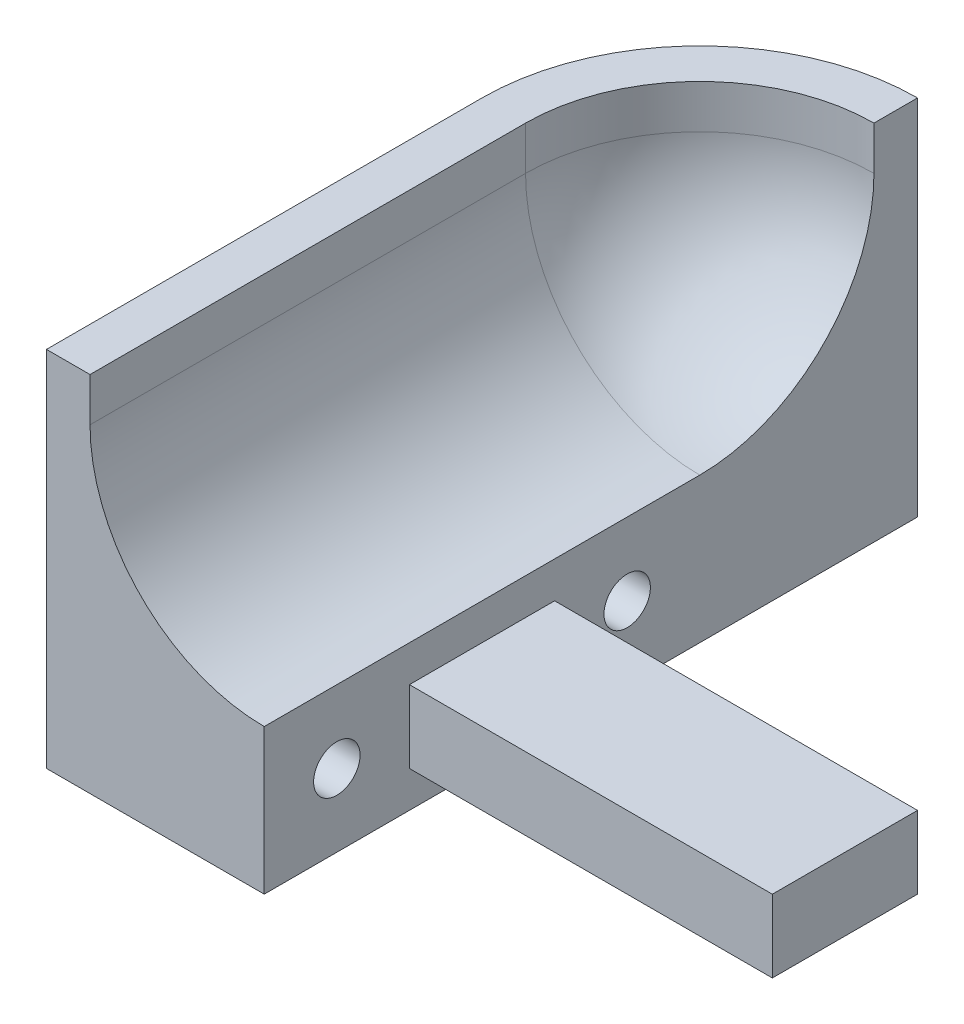
ISO-10303-21;
HEADER;
FILE_DESCRIPTION(('STEP AP214'),'2;1');
FILE_NAME('part.step','',(''),(''),'','','');
FILE_SCHEMA(('AUTOMOTIVE_DESIGN { 1 0 10303 214 1 1 1 1 }'));
ENDSEC;
DATA;
#1=APPLICATION_CONTEXT('core data for automotive mechanical design processes');
#2=APPLICATION_PROTOCOL_DEFINITION('international standard','automotive_design',2000,#1);
#3=PRODUCT_CONTEXT('',#1,'mechanical');
#4=PRODUCT('Part','Part','',(#3));
#5=PRODUCT_RELATED_PRODUCT_CATEGORY('part','',(#4));
#6=PRODUCT_DEFINITION_FORMATION('','',#4);
#7=PRODUCT_DEFINITION_CONTEXT('part definition',#1,'design');
#8=PRODUCT_DEFINITION('design','',#6,#7);
#9=PRODUCT_DEFINITION_SHAPE('','',#8);
#10=(LENGTH_UNIT() NAMED_UNIT(*) SI_UNIT(.MILLI.,.METRE.));
#11=(NAMED_UNIT(*) PLANE_ANGLE_UNIT() SI_UNIT($,.RADIAN.));
#12=(NAMED_UNIT(*) SI_UNIT($,.STERADIAN.) SOLID_ANGLE_UNIT());
#13=UNCERTAINTY_MEASURE_WITH_UNIT(LENGTH_MEASURE(1.E-05),#10,'distance_accuracy_value','');
#14=(GEOMETRIC_REPRESENTATION_CONTEXT(3) GLOBAL_UNCERTAINTY_ASSIGNED_CONTEXT((#13)) GLOBAL_UNIT_ASSIGNED_CONTEXT((#10,
#11,#12)) REPRESENTATION_CONTEXT('',''));
#15=CARTESIAN_POINT('',(0.,0.,0.));
#16=DIRECTION('',(0.,0.,1.));
#17=DIRECTION('',(1.,0.,0.));
#18=AXIS2_PLACEMENT_3D('',#15,#16,#17);
#19=CARTESIAN_POINT('',(0.,10.,0.));
#20=DIRECTION('',(1.,0.,0.));
#21=DIRECTION('',(0.,0.,-1.));
#22=AXIS2_PLACEMENT_3D('',#19,#20,#21);
#23=PLANE('',#22);
#24=DIRECTION('',(0.,0.,1.));
#25=VECTOR('',#24,1.);
#26=CARTESIAN_POINT('',(0.,0.,0.));
#27=LINE('',#26,#25);
#28=CARTESIAN_POINT('',(0.,0.,-30.));
#29=VERTEX_POINT('',#28);
#30=CARTESIAN_POINT('',(0.,0.,0.));
#31=VERTEX_POINT('',#30);
#32=EDGE_CURVE('E436',#29,#31,#27,.T.);
#33=ORIENTED_EDGE('',*,*,#32,.T.);
#34=DIRECTION('',(0.,-1.,0.));
#35=VECTOR('',#34,1.);
#36=CARTESIAN_POINT('',(0.,10.,0.));
#37=LINE('',#36,#35);
#38=CARTESIAN_POINT('',(0.,25.,0.));
#39=VERTEX_POINT('',#38);
#40=EDGE_CURVE('E451',#39,#31,#37,.T.);
#41=ORIENTED_EDGE('',*,*,#40,.F.);
#42=DIRECTION('',(0.,0.,1.));
#43=VECTOR('',#42,1.);
#44=CARTESIAN_POINT('',(0.,25.,-30.));
#45=LINE('',#44,#43);
#46=CARTESIAN_POINT('',(0.,25.,-30.));
#47=VERTEX_POINT('',#46);
#48=EDGE_CURVE('E413',#47,#39,#45,.T.);
#49=ORIENTED_EDGE('',*,*,#48,.F.);
#50=DIRECTION('',(0.,-1.,0.));
#51=VECTOR('',#50,1.);
#52=CARTESIAN_POINT('',(0.,10.,-30.));
#53=LINE('',#52,#51);
#54=EDGE_CURVE('E447',#47,#29,#53,.T.);
#55=ORIENTED_EDGE('',*,*,#54,.T.);
#56=EDGE_LOOP('',(#33,#41,#49,#55));
#57=FACE_BOUND('',#56,.T.);
#58=DIRECTION('',(0.,0.,1.));
#59=VECTOR('',#58,1.);
#60=CARTESIAN_POINT('',(0.,2.40192378864668,-3.5));
#61=LINE('',#60,#59);
#62=CARTESIAN_POINT('',(0.,2.40192378864668,-6.5));
#63=VERTEX_POINT('',#62);
#64=CARTESIAN_POINT('',(0.,2.40192378864668,-3.5));
#65=VERTEX_POINT('',#64);
#66=EDGE_CURVE('E297',#63,#65,#61,.T.);
#67=ORIENTED_EDGE('',*,*,#66,.F.);
#68=DIRECTION('',(0.,-0.866025403784439,0.5));
#69=VECTOR('',#68,1.);
#70=CARTESIAN_POINT('',(0.,2.40192378864668,-6.5));
#71=LINE('',#70,#69);
#72=CARTESIAN_POINT('',(0.,5.,-8.));
#73=VERTEX_POINT('',#72);
#74=EDGE_CURVE('E64',#73,#63,#71,.T.);
#75=ORIENTED_EDGE('',*,*,#74,.F.);
#76=DIRECTION('',(0.,-0.866025403784439,-0.5));
#77=VECTOR('',#76,1.);
#78=CARTESIAN_POINT('',(0.,5.,-8.));
#79=LINE('',#78,#77);
#80=CARTESIAN_POINT('',(0.,7.59807621135332,-6.5));
#81=VERTEX_POINT('',#80);
#82=EDGE_CURVE('E274',#81,#73,#79,.T.);
#83=ORIENTED_EDGE('',*,*,#82,.F.);
#84=DIRECTION('',(0.,0.,-1.));
#85=VECTOR('',#84,1.);
#86=CARTESIAN_POINT('',(0.,7.59807621135332,-6.5));
#87=LINE('',#86,#85);
#88=CARTESIAN_POINT('',(0.,7.59807621135331,-3.5));
#89=VERTEX_POINT('',#88);
#90=EDGE_CURVE('E309',#89,#81,#87,.T.);
#91=ORIENTED_EDGE('',*,*,#90,.F.);
#92=DIRECTION('',(0.,0.866025403784439,-0.5));
#93=VECTOR('',#92,1.);
#94=CARTESIAN_POINT('',(0.,7.59807621135331,-3.5));
#95=LINE('',#94,#93);
#96=CARTESIAN_POINT('',(0.,5.,-2.));
#97=VERTEX_POINT('',#96);
#98=EDGE_CURVE('E305',#97,#89,#95,.T.);
#99=ORIENTED_EDGE('',*,*,#98,.F.);
#100=DIRECTION('',(0.,0.866025403784439,0.5));
#101=VECTOR('',#100,1.);
#102=CARTESIAN_POINT('',(0.,5.,-2.));
#103=LINE('',#102,#101);
#104=EDGE_CURVE('E301',#65,#97,#103,.T.);
#105=ORIENTED_EDGE('',*,*,#104,.F.);
#106=EDGE_LOOP('',(#67,#75,#83,#91,#99,#105));
#107=FACE_BOUND('',#106,.T.);
#108=DIRECTION('',(0.,-0.866025403784439,-0.5));
#109=VECTOR('',#108,1.);
#110=CARTESIAN_POINT('',(0.,2.40192378864668,-23.5));
#111=LINE('',#110,#109);
#112=CARTESIAN_POINT('',(0.,5.,-22.));
#113=VERTEX_POINT('',#112);
#114=CARTESIAN_POINT('',(0.,2.40192378864668,-23.5));
#115=VERTEX_POINT('',#114);
#116=EDGE_CURVE('E56',#113,#115,#111,.T.);
#117=ORIENTED_EDGE('',*,*,#116,.T.);
#118=DIRECTION('',(0.,0.,-1.));
#119=VECTOR('',#118,1.);
#120=CARTESIAN_POINT('',(0.,2.40192378864668,-26.5));
#121=LINE('',#120,#119);
#122=CARTESIAN_POINT('',(0.,2.40192378864668,-26.5));
#123=VERTEX_POINT('',#122);
#124=EDGE_CURVE('E222',#115,#123,#121,.T.);
#125=ORIENTED_EDGE('',*,*,#124,.T.);
#126=DIRECTION('',(0.,0.866025403784439,-0.5));
#127=VECTOR('',#126,1.);
#128=CARTESIAN_POINT('',(0.,5.,-28.));
#129=LINE('',#128,#127);
#130=CARTESIAN_POINT('',(0.,5.,-28.));
#131=VERTEX_POINT('',#130);
#132=EDGE_CURVE('E226',#123,#131,#129,.T.);
#133=ORIENTED_EDGE('',*,*,#132,.T.);
#134=DIRECTION('',(0.,0.866025403784439,0.5));
#135=VECTOR('',#134,1.);
#136=CARTESIAN_POINT('',(0.,7.59807621135331,-26.5));
#137=LINE('',#136,#135);
#138=CARTESIAN_POINT('',(0.,7.59807621135331,-26.5));
#139=VERTEX_POINT('',#138);
#140=EDGE_CURVE('E248',#131,#139,#137,.T.);
#141=ORIENTED_EDGE('',*,*,#140,.T.);
#142=DIRECTION('',(0.,0.,1.));
#143=VECTOR('',#142,1.);
#144=CARTESIAN_POINT('',(0.,7.59807621135332,-23.5));
#145=LINE('',#144,#143);
#146=CARTESIAN_POINT('',(0.,7.59807621135332,-23.5));
#147=VERTEX_POINT('',#146);
#148=EDGE_CURVE('E244',#139,#147,#145,.T.);
#149=ORIENTED_EDGE('',*,*,#148,.T.);
#150=DIRECTION('',(0.,-0.866025403784439,0.5));
#151=VECTOR('',#150,1.);
#152=CARTESIAN_POINT('',(0.,5.,-22.));
#153=LINE('',#152,#151);
#154=EDGE_CURVE('E241',#147,#113,#153,.T.);
#155=ORIENTED_EDGE('',*,*,#154,.T.);
#156=EDGE_LOOP('',(#117,#125,#133,#141,#149,#155));
#157=FACE_BOUND('',#156,.T.);
#158=ADVANCED_FACE('F38',(#57,#107,#157),#23,.F.);
#159=CARTESIAN_POINT('',(15.,0.,-45.));
#160=DIRECTION('',(-1.,0.,0.));
#161=DIRECTION('',(0.,0.,1.));
#162=AXIS2_PLACEMENT_3D('',#159,#160,#161);
#163=PLANE('',#162);
#164=CARTESIAN_POINT('',(15.,22.,-30.));
#165=DIRECTION('',(-1.,0.,0.));
#166=DIRECTION('',(0.,0.,1.));
#167=AXIS2_PLACEMENT_3D('',#164,#165,#166);
#168=CIRCLE('',#167,12.);
#169=CARTESIAN_POINT('',(15.,10.,-30.));
#170=VERTEX_POINT('',#169);
#171=CARTESIAN_POINT('',(15.,22.,-42.));
#172=VERTEX_POINT('',#171);
#173=EDGE_CURVE('E390',#170,#172,#168,.F.);
#174=ORIENTED_EDGE('',*,*,#173,.F.);
#175=DIRECTION('',(0.,0.,1.));
#176=VECTOR('',#175,1.);
#177=CARTESIAN_POINT('',(15.,10.,-30.));
#178=LINE('',#177,#176);
#179=CARTESIAN_POINT('',(15.,10.,0.));
#180=VERTEX_POINT('',#179);
#181=EDGE_CURVE('E414',#180,#170,#178,.F.);
#182=ORIENTED_EDGE('',*,*,#181,.F.);
#183=DIRECTION('',(0.,1.,0.));
#184=VECTOR('',#183,1.);
#185=CARTESIAN_POINT('',(15.,0.,0.));
#186=LINE('',#185,#184);
#187=CARTESIAN_POINT('',(15.,0.,0.));
#188=VERTEX_POINT('',#187);
#189=EDGE_CURVE('E384',#188,#180,#186,.T.);
#190=ORIENTED_EDGE('',*,*,#189,.F.);
#191=DIRECTION('',(0.,0.,1.));
#192=VECTOR('',#191,1.);
#193=CARTESIAN_POINT('',(15.,0.,-45.));
#194=LINE('',#193,#192);
#195=CARTESIAN_POINT('',(15.,0.,-45.));
#196=VERTEX_POINT('',#195);
#197=EDGE_CURVE('E380',#196,#188,#194,.T.);
#198=ORIENTED_EDGE('',*,*,#197,.F.);
#199=DIRECTION('',(0.,1.,0.));
#200=VECTOR('',#199,1.);
#201=CARTESIAN_POINT('',(15.,0.,-45.));
#202=LINE('',#201,#200);
#203=CARTESIAN_POINT('',(15.,25.,-45.));
#204=VERTEX_POINT('',#203);
#205=EDGE_CURVE('E387',#196,#204,#202,.T.);
#206=ORIENTED_EDGE('',*,*,#205,.T.);
#207=DIRECTION('',(0.,0.,1.));
#208=VECTOR('',#207,1.);
#209=CARTESIAN_POINT('',(15.,25.,-45.));
#210=LINE('',#209,#208);
#211=CARTESIAN_POINT('',(15.,25.,-42.));
#212=VERTEX_POINT('',#211);
#213=EDGE_CURVE('E379',#204,#212,#210,.T.);
#214=ORIENTED_EDGE('',*,*,#213,.T.);
#215=DIRECTION('',(0.,-1.,0.));
#216=VECTOR('',#215,1.);
#217=CARTESIAN_POINT('',(15.,25.,-42.));
#218=LINE('',#217,#216);
#219=EDGE_CURVE('E397',#172,#212,#218,.F.);
#220=ORIENTED_EDGE('',*,*,#219,.F.);
#221=EDGE_LOOP('',(#174,#182,#190,#198,#206,#214,#220));
#222=FACE_BOUND('',#221,.T.);
#223=CARTESIAN_POINT('',(15.,5.,-5.));
#224=DIRECTION('',(-1.,0.,0.));
#225=DIRECTION('',(0.,0.,1.));
#226=AXIS2_PLACEMENT_3D('',#223,#224,#225);
#227=CIRCLE('',#226,1.6);
#228=CARTESIAN_POINT('',(15.,5.,-3.4));
#229=VERTEX_POINT('',#228);
#230=EDGE_CURVE('E401',#229,#229,#227,.T.);
#231=ORIENTED_EDGE('',*,*,#230,.T.);
#232=EDGE_LOOP('',(#231));
#233=FACE_BOUND('',#232,.T.);
#234=CARTESIAN_POINT('',(15.,5.,-25.));
#235=DIRECTION('',(-1.,0.,0.));
#236=DIRECTION('',(0.,0.,1.));
#237=AXIS2_PLACEMENT_3D('',#234,#235,#236);
#238=CIRCLE('',#237,1.6);
#239=CARTESIAN_POINT('',(15.,5.,-23.4));
#240=VERTEX_POINT('',#239);
#241=EDGE_CURVE('E405',#240,#240,#238,.T.);
#242=ORIENTED_EDGE('',*,*,#241,.T.);
#243=EDGE_LOOP('',(#242));
#244=FACE_BOUND('',#243,.T.);
#245=DIRECTION('',(0.,1.,0.));
#246=VECTOR('',#245,1.);
#247=CARTESIAN_POINT('',(15.,7.5,-20.));
#248=LINE('',#247,#246);
#249=CARTESIAN_POINT('',(15.,2.5,-20.));
#250=VERTEX_POINT('',#249);
#251=CARTESIAN_POINT('',(15.,7.5,-20.));
#252=VERTEX_POINT('',#251);
#253=EDGE_CURVE('E349',#250,#252,#248,.T.);
#254=ORIENTED_EDGE('',*,*,#253,.F.);
#255=DIRECTION('',(0.,0.,-1.));
#256=VECTOR('',#255,1.);
#257=CARTESIAN_POINT('',(15.,2.5,-20.));
#258=LINE('',#257,#256);
#259=CARTESIAN_POINT('',(15.,2.5,-10.));
#260=VERTEX_POINT('',#259);
#261=EDGE_CURVE('E339',#260,#250,#258,.T.);
#262=ORIENTED_EDGE('',*,*,#261,.F.);
#263=DIRECTION('',(0.,-1.,0.));
#264=VECTOR('',#263,1.);
#265=CARTESIAN_POINT('',(15.,7.5,-10.));
#266=LINE('',#265,#264);
#267=CARTESIAN_POINT('',(15.,7.5,-9.99999999999999));
#268=VERTEX_POINT('',#267);
#269=EDGE_CURVE('E357',#268,#260,#266,.T.);
#270=ORIENTED_EDGE('',*,*,#269,.F.);
#271=DIRECTION('',(0.,0.,1.));
#272=VECTOR('',#271,1.);
#273=CARTESIAN_POINT('',(15.,7.5,-20.));
#274=LINE('',#273,#272);
#275=EDGE_CURVE('E353',#252,#268,#274,.T.);
#276=ORIENTED_EDGE('',*,*,#275,.F.);
#277=EDGE_LOOP('',(#254,#262,#270,#276));
#278=FACE_BOUND('',#277,.T.);
#279=ADVANCED_FACE('F480',(#222,#233,#244,#278),#163,.F.);
#280=CARTESIAN_POINT('',(0.,10.,0.));
#281=DIRECTION('',(0.,0.,-1.));
#282=DIRECTION('',(-1.,0.,0.));
#283=AXIS2_PLACEMENT_3D('',#280,#281,#282);
#284=PLANE('',#283);
#285=DIRECTION('',(1.,0.,0.));
#286=VECTOR('',#285,1.);
#287=CARTESIAN_POINT('',(0.,0.,0.));
#288=LINE('',#287,#286);
#289=EDGE_CURVE('E440',#31,#188,#288,.T.);
#290=ORIENTED_EDGE('',*,*,#289,.T.);
#291=ORIENTED_EDGE('',*,*,#189,.T.);
#292=CARTESIAN_POINT('',(15.,22.,0.));
#293=DIRECTION('',(0.,0.,-1.));
#294=DIRECTION('',(-1.,0.,0.));
#295=AXIS2_PLACEMENT_3D('',#292,#293,#294);
#296=CIRCLE('',#295,12.);
#297=CARTESIAN_POINT('',(3.,22.,0.));
#298=VERTEX_POINT('',#297);
#299=EDGE_CURVE('E11',#180,#298,#296,.T.);
#300=ORIENTED_EDGE('',*,*,#299,.T.);
#301=DIRECTION('',(0.,-1.,0.));
#302=VECTOR('',#301,1.);
#303=CARTESIAN_POINT('',(3.,25.,0.));
#304=LINE('',#303,#302);
#305=CARTESIAN_POINT('',(3.,25.,0.));
#306=VERTEX_POINT('',#305);
#307=EDGE_CURVE('E432',#306,#298,#304,.T.);
#308=ORIENTED_EDGE('',*,*,#307,.F.);
#309=DIRECTION('',(1.,0.,0.));
#310=VECTOR('',#309,1.);
#311=CARTESIAN_POINT('',(0.,25.,0.));
#312=LINE('',#311,#310);
#313=EDGE_CURVE('E418',#39,#306,#312,.T.);
#314=ORIENTED_EDGE('',*,*,#313,.F.);
#315=ORIENTED_EDGE('',*,*,#40,.T.);
#316=EDGE_LOOP('',(#290,#291,#300,#308,#314,#315));
#317=FACE_BOUND('',#316,.T.);
#318=ADVANCED_FACE('F483',(#317),#284,.F.);
#319=CARTESIAN_POINT('',(15.,10.,-30.));
#320=DIRECTION('',(0.,-1.,0.));
#321=DIRECTION('',(0.,0.,-1.));
#322=AXIS2_PLACEMENT_3D('',#319,#320,#321);
#323=CYLINDRICAL_SURFACE('',#322,15.);
#324=CARTESIAN_POINT('',(15.,25.,-30.));
#325=DIRECTION('',(0.,1.,0.));
#326=DIRECTION('',(0.,0.,1.));
#327=AXIS2_PLACEMENT_3D('',#324,#325,#326);
#328=CIRCLE('',#327,15.);
#329=EDGE_CURVE('E410',#204,#47,#328,.T.);
#330=ORIENTED_EDGE('',*,*,#329,.F.);
#331=ORIENTED_EDGE('',*,*,#205,.F.);
#332=CARTESIAN_POINT('',(15.,0.,-30.));
#333=DIRECTION('',(0.,1.,0.));
#334=DIRECTION('',(0.,0.,-1.));
#335=AXIS2_PLACEMENT_3D('',#332,#333,#334);
#336=CIRCLE('',#335,15.);
#337=EDGE_CURVE('E444',#196,#29,#336,.T.);
#338=ORIENTED_EDGE('',*,*,#337,.T.);
#339=ORIENTED_EDGE('',*,*,#54,.F.);
#340=EDGE_LOOP('',(#330,#331,#338,#339));
#341=FACE_BOUND('',#340,.T.);
#342=ADVANCED_FACE('F551',(#341),#323,.T.);
#343=CARTESIAN_POINT('',(15.,0.,-30.));
#344=DIRECTION('',(0.,-1.,0.));
#345=DIRECTION('',(0.,0.,-1.));
#346=AXIS2_PLACEMENT_3D('',#343,#344,#345);
#347=PLANE('',#346);
#348=ORIENTED_EDGE('',*,*,#197,.T.);
#349=ORIENTED_EDGE('',*,*,#289,.F.);
#350=ORIENTED_EDGE('',*,*,#32,.F.);
#351=ORIENTED_EDGE('',*,*,#337,.F.);
#352=EDGE_LOOP('',(#348,#349,#350,#351));
#353=FACE_BOUND('',#352,.T.);
#354=ADVANCED_FACE('F547',(#353),#347,.T.);
#355=CARTESIAN_POINT('',(3.,25.,-30.));
#356=DIRECTION('',(-1.,0.,0.));
#357=DIRECTION('',(0.,0.,1.));
#358=AXIS2_PLACEMENT_3D('',#355,#356,#357);
#359=PLANE('',#358);
#360=ORIENTED_EDGE('',*,*,#307,.T.);
#361=DIRECTION('',(0.,0.,-1.));
#362=VECTOR('',#361,1.);
#363=CARTESIAN_POINT('',(3.,22.,-30.));
#364=LINE('',#363,#362);
#365=CARTESIAN_POINT('',(3.,22.,-30.));
#366=VERTEX_POINT('',#365);
#367=EDGE_CURVE('E455',#298,#366,#364,.T.);
#368=ORIENTED_EDGE('',*,*,#367,.T.);
#369=DIRECTION('',(0.,-1.,0.));
#370=VECTOR('',#369,1.);
#371=CARTESIAN_POINT('',(3.,25.,-30.));
#372=LINE('',#371,#370);
#373=CARTESIAN_POINT('',(3.,25.,-30.));
#374=VERTEX_POINT('',#373);
#375=EDGE_CURVE('E428',#374,#366,#372,.T.);
#376=ORIENTED_EDGE('',*,*,#375,.F.);
#377=DIRECTION('',(0.,0.,-1.));
#378=VECTOR('',#377,1.);
#379=CARTESIAN_POINT('',(3.,25.,-3.));
#380=LINE('',#379,#378);
#381=EDGE_CURVE('E421',#306,#374,#380,.T.);
#382=ORIENTED_EDGE('',*,*,#381,.F.);
#383=EDGE_LOOP('',(#360,#368,#376,#382));
#384=FACE_BOUND('',#383,.T.);
#385=ADVANCED_FACE('F536',(#384),#359,.F.);
#386=CARTESIAN_POINT('',(15.,25.,-30.));
#387=DIRECTION('',(0.,-1.,0.));
#388=DIRECTION('',(0.,0.,-1.));
#389=AXIS2_PLACEMENT_3D('',#386,#387,#388);
#390=CYLINDRICAL_SURFACE('',#389,12.);
#391=CARTESIAN_POINT('',(15.,22.,-30.));
#392=DIRECTION('',(0.,-1.,0.));
#393=DIRECTION('',(0.,0.,-1.));
#394=AXIS2_PLACEMENT_3D('',#391,#392,#393);
#395=CIRCLE('',#394,12.);
#396=EDGE_CURVE('E48',#366,#172,#395,.T.);
#397=ORIENTED_EDGE('',*,*,#396,.T.);
#398=ORIENTED_EDGE('',*,*,#219,.T.);
#399=CARTESIAN_POINT('',(15.,25.,-30.));
#400=DIRECTION('',(0.,-1.,0.));
#401=DIRECTION('',(0.,0.,1.));
#402=AXIS2_PLACEMENT_3D('',#399,#400,#401);
#403=CIRCLE('',#402,12.);
#404=EDGE_CURVE('E424',#374,#212,#403,.T.);
#405=ORIENTED_EDGE('',*,*,#404,.F.);
#406=ORIENTED_EDGE('',*,*,#375,.T.);
#407=EDGE_LOOP('',(#397,#398,#405,#406));
#408=FACE_BOUND('',#407,.T.);
#409=ADVANCED_FACE('F553',(#408),#390,.F.);
#410=CARTESIAN_POINT('',(15.,25.,-30.));
#411=DIRECTION('',(0.,1.,0.));
#412=DIRECTION('',(0.,0.,1.));
#413=AXIS2_PLACEMENT_3D('',#410,#411,#412);
#414=PLANE('',#413);
#415=ORIENTED_EDGE('',*,*,#213,.F.);
#416=ORIENTED_EDGE('',*,*,#329,.T.);
#417=ORIENTED_EDGE('',*,*,#48,.T.);
#418=ORIENTED_EDGE('',*,*,#313,.T.);
#419=ORIENTED_EDGE('',*,*,#381,.T.);
#420=ORIENTED_EDGE('',*,*,#404,.T.);
#421=EDGE_LOOP('',(#415,#416,#417,#418,#419,#420));
#422=FACE_BOUND('',#421,.T.);
#423=ADVANCED_FACE('F541',(#422),#414,.T.);
#424=CARTESIAN_POINT('',(30.,5.,-25.));
#425=DIRECTION('',(-1.,0.,0.));
#426=DIRECTION('',(0.,0.,1.));
#427=AXIS2_PLACEMENT_3D('',#424,#425,#426);
#428=CYLINDRICAL_SURFACE('',#427,1.6);
#429=CARTESIAN_POINT('',(4.,5.,-25.));
#430=DIRECTION('',(1.,0.,0.));
#431=DIRECTION('',(0.,0.,-1.));
#432=AXIS2_PLACEMENT_3D('',#429,#430,#431);
#433=CIRCLE('',#432,1.6);
#434=CARTESIAN_POINT('',(4.,5.,-26.6));
#435=VERTEX_POINT('',#434);
#436=EDGE_CURVE('E42',#435,#435,#433,.T.);
#437=ORIENTED_EDGE('',*,*,#436,.F.);
#438=EDGE_LOOP('',(#437));
#439=FACE_BOUND('',#438,.T.);
#440=ORIENTED_EDGE('',*,*,#241,.F.);
#441=EDGE_LOOP('',(#440));
#442=FACE_BOUND('',#441,.T.);
#443=ADVANCED_FACE('F476',(#439,#442),#428,.F.);
#444=CARTESIAN_POINT('',(30.,5.,-5.));
#445=DIRECTION('',(-1.,0.,0.));
#446=DIRECTION('',(0.,0.,1.));
#447=AXIS2_PLACEMENT_3D('',#444,#445,#446);
#448=CYLINDRICAL_SURFACE('',#447,1.6);
#449=CARTESIAN_POINT('',(4.,5.,-5.));
#450=DIRECTION('',(1.,0.,0.));
#451=DIRECTION('',(0.,0.,-1.));
#452=AXIS2_PLACEMENT_3D('',#449,#450,#451);
#453=CIRCLE('',#452,1.6);
#454=CARTESIAN_POINT('',(4.,5.,-6.6));
#455=VERTEX_POINT('',#454);
#456=EDGE_CURVE('E319',#455,#455,#453,.T.);
#457=ORIENTED_EDGE('',*,*,#456,.F.);
#458=EDGE_LOOP('',(#457));
#459=FACE_BOUND('',#458,.T.);
#460=ORIENTED_EDGE('',*,*,#230,.F.);
#461=EDGE_LOOP('',(#460));
#462=FACE_BOUND('',#461,.T.);
#463=ADVANCED_FACE('F473',(#459,#462),#448,.F.);
#464=CARTESIAN_POINT('',(15.,22.,-30.));
#465=DIRECTION('',(0.,-1.,0.));
#466=DIRECTION('',(0.,0.,-1.));
#467=AXIS2_PLACEMENT_3D('',#464,#465,#466);
#468=SPHERICAL_SURFACE('',#467,12.);
#469=CARTESIAN_POINT('',(15.,22.,-30.));
#470=DIRECTION('',(0.,0.,-1.));
#471=DIRECTION('',(-1.,0.,0.));
#472=AXIS2_PLACEMENT_3D('',#469,#470,#471);
#473=CIRCLE('',#472,12.);
#474=EDGE_CURVE('E409',#170,#366,#473,.T.);
#475=ORIENTED_EDGE('',*,*,#474,.F.);
#476=ORIENTED_EDGE('',*,*,#173,.T.);
#477=ORIENTED_EDGE('',*,*,#396,.F.);
#478=EDGE_LOOP('',(#475,#476,#477));
#479=FACE_BOUND('',#478,.T.);
#480=ADVANCED_FACE('F40',(#479),#468,.F.);
#481=CARTESIAN_POINT('',(15.,22.,-30.));
#482=DIRECTION('',(0.,0.,1.));
#483=DIRECTION('',(1.,0.,0.));
#484=AXIS2_PLACEMENT_3D('',#481,#482,#483);
#485=CYLINDRICAL_SURFACE('',#484,12.);
#486=ORIENTED_EDGE('',*,*,#299,.F.);
#487=ORIENTED_EDGE('',*,*,#181,.T.);
#488=ORIENTED_EDGE('',*,*,#474,.T.);
#489=ORIENTED_EDGE('',*,*,#367,.F.);
#490=EDGE_LOOP('',(#486,#487,#488,#489));
#491=FACE_BOUND('',#490,.T.);
#492=ADVANCED_FACE('F512',(#491),#485,.F.);
#493=CARTESIAN_POINT('',(40.,7.5,-20.));
#494=DIRECTION('',(0.,0.,1.));
#495=DIRECTION('',(1.,0.,0.));
#496=AXIS2_PLACEMENT_3D('',#493,#494,#495);
#497=PLANE('',#496);
#498=ORIENTED_EDGE('',*,*,#253,.T.);
#499=DIRECTION('',(-1.,0.,0.));
#500=VECTOR('',#499,1.);
#501=CARTESIAN_POINT('',(40.,7.5,-20.));
#502=LINE('',#501,#500);
#503=CARTESIAN_POINT('',(40.,7.5,-20.));
#504=VERTEX_POINT('',#503);
#505=EDGE_CURVE('E375',#504,#252,#502,.T.);
#506=ORIENTED_EDGE('',*,*,#505,.F.);
#507=DIRECTION('',(0.,1.,0.));
#508=VECTOR('',#507,1.);
#509=CARTESIAN_POINT('',(40.,7.5,-20.));
#510=LINE('',#509,#508);
#511=CARTESIAN_POINT('',(40.,2.5,-20.));
#512=VERTEX_POINT('',#511);
#513=EDGE_CURVE('E334',#512,#504,#510,.T.);
#514=ORIENTED_EDGE('',*,*,#513,.F.);
#515=DIRECTION('',(-1.,0.,0.));
#516=VECTOR('',#515,1.);
#517=CARTESIAN_POINT('',(40.,2.5,-20.));
#518=LINE('',#517,#516);
#519=EDGE_CURVE('E348',#512,#250,#518,.T.);
#520=ORIENTED_EDGE('',*,*,#519,.T.);
#521=EDGE_LOOP('',(#498,#506,#514,#520));
#522=FACE_BOUND('',#521,.T.);
#523=ADVANCED_FACE('F496',(#522),#497,.F.);
#524=CARTESIAN_POINT('',(40.,7.5,-20.));
#525=DIRECTION('',(0.,-1.,0.));
#526=DIRECTION('',(0.,0.,-1.));
#527=AXIS2_PLACEMENT_3D('',#524,#525,#526);
#528=PLANE('',#527);
#529=ORIENTED_EDGE('',*,*,#275,.T.);
#530=DIRECTION('',(-1.,0.,0.));
#531=VECTOR('',#530,1.);
#532=CARTESIAN_POINT('',(40.,7.5,-10.));
#533=LINE('',#532,#531);
#534=CARTESIAN_POINT('',(40.,7.5,-10.));
#535=VERTEX_POINT('',#534);
#536=EDGE_CURVE('E371',#535,#268,#533,.T.);
#537=ORIENTED_EDGE('',*,*,#536,.F.);
#538=DIRECTION('',(0.,0.,1.));
#539=VECTOR('',#538,1.);
#540=CARTESIAN_POINT('',(40.,7.5,-20.));
#541=LINE('',#540,#539);
#542=EDGE_CURVE('E338',#504,#535,#541,.T.);
#543=ORIENTED_EDGE('',*,*,#542,.F.);
#544=ORIENTED_EDGE('',*,*,#505,.T.);
#545=EDGE_LOOP('',(#529,#537,#543,#544));
#546=FACE_BOUND('',#545,.T.);
#547=ADVANCED_FACE('F504',(#546),#528,.F.);
#548=CARTESIAN_POINT('',(40.,7.5,-10.));
#549=DIRECTION('',(0.,0.,-1.));
#550=DIRECTION('',(0.,1.,0.));
#551=AXIS2_PLACEMENT_3D('',#548,#549,#550);
#552=PLANE('',#551);
#553=ORIENTED_EDGE('',*,*,#269,.T.);
#554=DIRECTION('',(-1.,0.,0.));
#555=VECTOR('',#554,1.);
#556=CARTESIAN_POINT('',(40.,2.5,-10.));
#557=LINE('',#556,#555);
#558=CARTESIAN_POINT('',(40.,2.5,-10.));
#559=VERTEX_POINT('',#558);
#560=EDGE_CURVE('E367',#559,#260,#557,.T.);
#561=ORIENTED_EDGE('',*,*,#560,.F.);
#562=DIRECTION('',(0.,-1.,0.));
#563=VECTOR('',#562,1.);
#564=CARTESIAN_POINT('',(40.,7.5,-10.));
#565=LINE('',#564,#563);
#566=EDGE_CURVE('E342',#535,#559,#565,.T.);
#567=ORIENTED_EDGE('',*,*,#566,.F.);
#568=ORIENTED_EDGE('',*,*,#536,.T.);
#569=EDGE_LOOP('',(#553,#561,#567,#568));
#570=FACE_BOUND('',#569,.T.);
#571=ADVANCED_FACE('F502',(#570),#552,.F.);
#572=CARTESIAN_POINT('',(40.,2.5,-20.));
#573=DIRECTION('',(0.,1.,0.));
#574=DIRECTION('',(0.,0.,1.));
#575=AXIS2_PLACEMENT_3D('',#572,#573,#574);
#576=PLANE('',#575);
#577=ORIENTED_EDGE('',*,*,#261,.T.);
#578=ORIENTED_EDGE('',*,*,#519,.F.);
#579=DIRECTION('',(0.,0.,-1.));
#580=VECTOR('',#579,1.);
#581=CARTESIAN_POINT('',(40.,2.5,-20.));
#582=LINE('',#581,#580);
#583=EDGE_CURVE('E345',#559,#512,#582,.T.);
#584=ORIENTED_EDGE('',*,*,#583,.F.);
#585=ORIENTED_EDGE('',*,*,#560,.T.);
#586=EDGE_LOOP('',(#577,#578,#584,#585));
#587=FACE_BOUND('',#586,.T.);
#588=ADVANCED_FACE('F492',(#587),#576,.F.);
#589=CARTESIAN_POINT('',(40.,0.,0.));
#590=DIRECTION('',(-1.,0.,0.));
#591=DIRECTION('',(0.,0.,1.));
#592=AXIS2_PLACEMENT_3D('',#589,#590,#591);
#593=PLANE('',#592);
#594=ORIENTED_EDGE('',*,*,#513,.T.);
#595=ORIENTED_EDGE('',*,*,#542,.T.);
#596=ORIENTED_EDGE('',*,*,#566,.T.);
#597=ORIENTED_EDGE('',*,*,#583,.T.);
#598=EDGE_LOOP('',(#594,#595,#596,#597));
#599=FACE_BOUND('',#598,.T.);
#600=ADVANCED_FACE('F498',(#599),#593,.F.);
#601=CARTESIAN_POINT('',(4.,2.40192378864668,-6.5));
#602=DIRECTION('',(0.,-0.5,-0.866025403784439));
#603=DIRECTION('',(0.,0.866025403784439,-0.5));
#604=AXIS2_PLACEMENT_3D('',#601,#602,#603);
#605=PLANE('',#604);
#606=ORIENTED_EDGE('',*,*,#74,.T.);
#607=DIRECTION('',(-1.,0.,0.));
#608=VECTOR('',#607,1.);
#609=CARTESIAN_POINT('',(4.,2.40192378864668,-6.5));
#610=LINE('',#609,#608);
#611=CARTESIAN_POINT('',(4.,2.40192378864668,-6.5));
#612=VERTEX_POINT('',#611);
#613=EDGE_CURVE('E294',#612,#63,#610,.T.);
#614=ORIENTED_EDGE('',*,*,#613,.F.);
#615=DIRECTION('',(0.,-0.866025403784439,0.5));
#616=VECTOR('',#615,1.);
#617=CARTESIAN_POINT('',(4.,2.40192378864668,-6.5));
#618=LINE('',#617,#616);
#619=CARTESIAN_POINT('',(4.,5.,-8.));
#620=VERTEX_POINT('',#619);
#621=EDGE_CURVE('E269',#620,#612,#618,.T.);
#622=ORIENTED_EDGE('',*,*,#621,.F.);
#623=DIRECTION('',(-1.,0.,0.));
#624=VECTOR('',#623,1.);
#625=CARTESIAN_POINT('',(4.,5.,-8.));
#626=LINE('',#625,#624);
#627=EDGE_CURVE('E316',#620,#73,#626,.T.);
#628=ORIENTED_EDGE('',*,*,#627,.T.);
#629=EDGE_LOOP('',(#606,#614,#622,#628));
#630=FACE_BOUND('',#629,.T.);
#631=ADVANCED_FACE('F613',(#630),#605,.F.);
#632=CARTESIAN_POINT('',(4.,5.,-8.));
#633=DIRECTION('',(0.,0.5,-0.866025403784439));
#634=DIRECTION('',(0.,0.866025403784439,0.5));
#635=AXIS2_PLACEMENT_3D('',#632,#633,#634);
#636=PLANE('',#635);
#637=ORIENTED_EDGE('',*,*,#82,.T.);
#638=ORIENTED_EDGE('',*,*,#627,.F.);
#639=DIRECTION('',(0.,-0.866025403784439,-0.5));
#640=VECTOR('',#639,1.);
#641=CARTESIAN_POINT('',(4.,5.,-8.));
#642=LINE('',#641,#640);
#643=CARTESIAN_POINT('',(4.,7.59807621135332,-6.5));
#644=VERTEX_POINT('',#643);
#645=EDGE_CURVE('E290',#644,#620,#642,.T.);
#646=ORIENTED_EDGE('',*,*,#645,.F.);
#647=DIRECTION('',(-1.,0.,0.));
#648=VECTOR('',#647,1.);
#649=CARTESIAN_POINT('',(4.,7.59807621135332,-6.5));
#650=LINE('',#649,#648);
#651=EDGE_CURVE('E320',#644,#81,#650,.T.);
#652=ORIENTED_EDGE('',*,*,#651,.T.);
#653=EDGE_LOOP('',(#637,#638,#646,#652));
#654=FACE_BOUND('',#653,.T.);
#655=ADVANCED_FACE('F631',(#654),#636,.F.);
#656=CARTESIAN_POINT('',(4.,7.59807621135332,-6.5));
#657=DIRECTION('',(0.,1.,0.));
#658=DIRECTION('',(0.,0.,1.));
#659=AXIS2_PLACEMENT_3D('',#656,#657,#658);
#660=PLANE('',#659);
#661=ORIENTED_EDGE('',*,*,#90,.T.);
#662=ORIENTED_EDGE('',*,*,#651,.F.);
#663=DIRECTION('',(0.,0.,-1.));
#664=VECTOR('',#663,1.);
#665=CARTESIAN_POINT('',(4.,7.59807621135332,-6.5));
#666=LINE('',#665,#664);
#667=CARTESIAN_POINT('',(4.,7.59807621135331,-3.5));
#668=VERTEX_POINT('',#667);
#669=EDGE_CURVE('E286',#668,#644,#666,.T.);
#670=ORIENTED_EDGE('',*,*,#669,.F.);
#671=DIRECTION('',(-1.,0.,0.));
#672=VECTOR('',#671,1.);
#673=CARTESIAN_POINT('',(4.,7.59807621135331,-3.5));
#674=LINE('',#673,#672);
#675=EDGE_CURVE('E323',#668,#89,#674,.T.);
#676=ORIENTED_EDGE('',*,*,#675,.T.);
#677=EDGE_LOOP('',(#661,#662,#670,#676));
#678=FACE_BOUND('',#677,.T.);
#679=ADVANCED_FACE('F640',(#678),#660,.F.);
#680=CARTESIAN_POINT('',(4.,7.59807621135331,-3.5));
#681=DIRECTION('',(0.,0.5,0.866025403784439));
#682=DIRECTION('',(0.,-0.866025403784439,0.5));
#683=AXIS2_PLACEMENT_3D('',#680,#681,#682);
#684=PLANE('',#683);
#685=ORIENTED_EDGE('',*,*,#98,.T.);
#686=ORIENTED_EDGE('',*,*,#675,.F.);
#687=DIRECTION('',(0.,0.866025403784439,-0.5));
#688=VECTOR('',#687,1.);
#689=CARTESIAN_POINT('',(4.,7.59807621135331,-3.5));
#690=LINE('',#689,#688);
#691=CARTESIAN_POINT('',(4.,5.,-2.));
#692=VERTEX_POINT('',#691);
#693=EDGE_CURVE('E282',#692,#668,#690,.T.);
#694=ORIENTED_EDGE('',*,*,#693,.F.);
#695=DIRECTION('',(-1.,0.,0.));
#696=VECTOR('',#695,1.);
#697=CARTESIAN_POINT('',(4.,5.,-2.));
#698=LINE('',#697,#696);
#699=EDGE_CURVE('E326',#692,#97,#698,.T.);
#700=ORIENTED_EDGE('',*,*,#699,.T.);
#701=EDGE_LOOP('',(#685,#686,#694,#700));
#702=FACE_BOUND('',#701,.T.);
#703=ADVANCED_FACE('F650',(#702),#684,.F.);
#704=CARTESIAN_POINT('',(4.,5.,-2.));
#705=DIRECTION('',(0.,-0.5,0.866025403784439));
#706=DIRECTION('',(0.,-0.866025403784439,-0.5));
#707=AXIS2_PLACEMENT_3D('',#704,#705,#706);
#708=PLANE('',#707);
#709=ORIENTED_EDGE('',*,*,#104,.T.);
#710=ORIENTED_EDGE('',*,*,#699,.F.);
#711=DIRECTION('',(0.,0.866025403784439,0.5));
#712=VECTOR('',#711,1.);
#713=CARTESIAN_POINT('',(4.,5.,-2.));
#714=LINE('',#713,#712);
#715=CARTESIAN_POINT('',(4.,2.40192378864668,-3.5));
#716=VERTEX_POINT('',#715);
#717=EDGE_CURVE('E278',#716,#692,#714,.T.);
#718=ORIENTED_EDGE('',*,*,#717,.F.);
#719=DIRECTION('',(-1.,0.,0.));
#720=VECTOR('',#719,1.);
#721=CARTESIAN_POINT('',(4.,2.40192378864668,-3.5));
#722=LINE('',#721,#720);
#723=EDGE_CURVE('E329',#716,#65,#722,.T.);
#724=ORIENTED_EDGE('',*,*,#723,.T.);
#725=EDGE_LOOP('',(#709,#710,#718,#724));
#726=FACE_BOUND('',#725,.T.);
#727=ADVANCED_FACE('F660',(#726),#708,.F.);
#728=CARTESIAN_POINT('',(4.,2.40192378864668,-3.5));
#729=DIRECTION('',(0.,-1.,0.));
#730=DIRECTION('',(0.,0.,-1.));
#731=AXIS2_PLACEMENT_3D('',#728,#729,#730);
#732=PLANE('',#731);
#733=ORIENTED_EDGE('',*,*,#66,.T.);
#734=ORIENTED_EDGE('',*,*,#723,.F.);
#735=DIRECTION('',(0.,0.,1.));
#736=VECTOR('',#735,1.);
#737=CARTESIAN_POINT('',(4.,2.40192378864668,-3.5));
#738=LINE('',#737,#736);
#739=EDGE_CURVE('E273',#612,#716,#738,.T.);
#740=ORIENTED_EDGE('',*,*,#739,.F.);
#741=ORIENTED_EDGE('',*,*,#613,.T.);
#742=EDGE_LOOP('',(#733,#734,#740,#741));
#743=FACE_BOUND('',#742,.T.);
#744=ADVANCED_FACE('F670',(#743),#732,.F.);
#745=CARTESIAN_POINT('',(4.,0.,0.));
#746=DIRECTION('',(1.,0.,0.));
#747=DIRECTION('',(0.,0.,-1.));
#748=AXIS2_PLACEMENT_3D('',#745,#746,#747);
#749=PLANE('',#748);
#750=ORIENTED_EDGE('',*,*,#456,.T.);
#751=EDGE_LOOP('',(#750));
#752=FACE_BOUND('',#751,.T.);
#753=ORIENTED_EDGE('',*,*,#621,.T.);
#754=ORIENTED_EDGE('',*,*,#739,.T.);
#755=ORIENTED_EDGE('',*,*,#717,.T.);
#756=ORIENTED_EDGE('',*,*,#693,.T.);
#757=ORIENTED_EDGE('',*,*,#669,.T.);
#758=ORIENTED_EDGE('',*,*,#645,.T.);
#759=EDGE_LOOP('',(#753,#754,#755,#756,#757,#758));
#760=FACE_BOUND('',#759,.T.);
#761=ADVANCED_FACE('F470',(#752,#760),#749,.F.);
#762=CARTESIAN_POINT('',(4.,2.40192378864668,-23.5));
#763=DIRECTION('',(0.,0.5,-0.866025403784439));
#764=DIRECTION('',(0.,0.866025403784439,0.5));
#765=AXIS2_PLACEMENT_3D('',#762,#763,#764);
#766=PLANE('',#765);
#767=ORIENTED_EDGE('',*,*,#116,.F.);
#768=DIRECTION('',(-1.,0.,0.));
#769=VECTOR('',#768,1.);
#770=CARTESIAN_POINT('',(4.,5.,-22.));
#771=LINE('',#770,#769);
#772=CARTESIAN_POINT('',(4.,5.,-22.));
#773=VERTEX_POINT('',#772);
#774=EDGE_CURVE('E203',#773,#113,#771,.T.);
#775=ORIENTED_EDGE('',*,*,#774,.F.);
#776=DIRECTION('',(0.,-0.866025403784439,-0.5));
#777=VECTOR('',#776,1.);
#778=CARTESIAN_POINT('',(4.,2.40192378864668,-23.5));
#779=LINE('',#778,#777);
#780=CARTESIAN_POINT('',(4.,2.40192378864668,-23.5));
#781=VERTEX_POINT('',#780);
#782=EDGE_CURVE('E211',#773,#781,#779,.T.);
#783=ORIENTED_EDGE('',*,*,#782,.T.);
#784=DIRECTION('',(-1.,0.,0.));
#785=VECTOR('',#784,1.);
#786=CARTESIAN_POINT('',(4.,2.40192378864668,-23.5));
#787=LINE('',#786,#785);
#788=EDGE_CURVE('E255',#781,#115,#787,.T.);
#789=ORIENTED_EDGE('',*,*,#788,.T.);
#790=EDGE_LOOP('',(#767,#775,#783,#789));
#791=FACE_BOUND('',#790,.T.);
#792=ADVANCED_FACE('F214',(#791),#766,.T.);
#793=CARTESIAN_POINT('',(4.,2.40192378864668,-26.5));
#794=DIRECTION('',(0.,1.,0.));
#795=DIRECTION('',(0.,0.,1.));
#796=AXIS2_PLACEMENT_3D('',#793,#794,#795);
#797=PLANE('',#796);
#798=ORIENTED_EDGE('',*,*,#124,.F.);
#799=ORIENTED_EDGE('',*,*,#788,.F.);
#800=DIRECTION('',(0.,0.,-1.));
#801=VECTOR('',#800,1.);
#802=CARTESIAN_POINT('',(4.,2.40192378864668,-26.5));
#803=LINE('',#802,#801);
#804=CARTESIAN_POINT('',(4.,2.40192378864668,-26.5));
#805=VERTEX_POINT('',#804);
#806=EDGE_CURVE('E217',#781,#805,#803,.T.);
#807=ORIENTED_EDGE('',*,*,#806,.T.);
#808=DIRECTION('',(-1.,0.,0.));
#809=VECTOR('',#808,1.);
#810=CARTESIAN_POINT('',(4.,2.40192378864668,-26.5));
#811=LINE('',#810,#809);
#812=EDGE_CURVE('E258',#805,#123,#811,.T.);
#813=ORIENTED_EDGE('',*,*,#812,.T.);
#814=EDGE_LOOP('',(#798,#799,#807,#813));
#815=FACE_BOUND('',#814,.T.);
#816=ADVANCED_FACE('F709',(#815),#797,.T.);
#817=CARTESIAN_POINT('',(4.,5.,-28.));
#818=DIRECTION('',(0.,0.5,0.866025403784439));
#819=DIRECTION('',(0.,-0.866025403784439,0.5));
#820=AXIS2_PLACEMENT_3D('',#817,#818,#819);
#821=PLANE('',#820);
#822=ORIENTED_EDGE('',*,*,#132,.F.);
#823=ORIENTED_EDGE('',*,*,#812,.F.);
#824=DIRECTION('',(0.,0.866025403784439,-0.5));
#825=VECTOR('',#824,1.);
#826=CARTESIAN_POINT('',(4.,5.,-28.));
#827=LINE('',#826,#825);
#828=CARTESIAN_POINT('',(4.,5.,-28.));
#829=VERTEX_POINT('',#828);
#830=EDGE_CURVE('E234',#805,#829,#827,.T.);
#831=ORIENTED_EDGE('',*,*,#830,.T.);
#832=DIRECTION('',(-1.,0.,0.));
#833=VECTOR('',#832,1.);
#834=CARTESIAN_POINT('',(4.,5.,-28.));
#835=LINE('',#834,#833);
#836=EDGE_CURVE('E261',#829,#131,#835,.T.);
#837=ORIENTED_EDGE('',*,*,#836,.T.);
#838=EDGE_LOOP('',(#822,#823,#831,#837));
#839=FACE_BOUND('',#838,.T.);
#840=ADVANCED_FACE('F718',(#839),#821,.T.);
#841=CARTESIAN_POINT('',(4.,7.59807621135331,-26.5));
#842=DIRECTION('',(0.,-0.5,0.866025403784439));
#843=DIRECTION('',(0.,-0.866025403784439,-0.5));
#844=AXIS2_PLACEMENT_3D('',#841,#842,#843);
#845=PLANE('',#844);
#846=ORIENTED_EDGE('',*,*,#140,.F.);
#847=ORIENTED_EDGE('',*,*,#836,.F.);
#848=DIRECTION('',(0.,0.866025403784439,0.5));
#849=VECTOR('',#848,1.);
#850=CARTESIAN_POINT('',(4.,7.59807621135331,-26.5));
#851=LINE('',#850,#849);
#852=CARTESIAN_POINT('',(4.,7.59807621135331,-26.5));
#853=VERTEX_POINT('',#852);
#854=EDGE_CURVE('E231',#829,#853,#851,.T.);
#855=ORIENTED_EDGE('',*,*,#854,.T.);
#856=DIRECTION('',(-1.,0.,0.));
#857=VECTOR('',#856,1.);
#858=CARTESIAN_POINT('',(4.,7.59807621135331,-26.5));
#859=LINE('',#858,#857);
#860=EDGE_CURVE('E264',#853,#139,#859,.T.);
#861=ORIENTED_EDGE('',*,*,#860,.T.);
#862=EDGE_LOOP('',(#846,#847,#855,#861));
#863=FACE_BOUND('',#862,.T.);
#864=ADVANCED_FACE('F728',(#863),#845,.T.);
#865=CARTESIAN_POINT('',(4.,7.59807621135332,-23.5));
#866=DIRECTION('',(0.,-1.,0.));
#867=DIRECTION('',(0.,0.,-1.));
#868=AXIS2_PLACEMENT_3D('',#865,#866,#867);
#869=PLANE('',#868);
#870=ORIENTED_EDGE('',*,*,#148,.F.);
#871=ORIENTED_EDGE('',*,*,#860,.F.);
#872=DIRECTION('',(0.,0.,1.));
#873=VECTOR('',#872,1.);
#874=CARTESIAN_POINT('',(4.,7.59807621135332,-23.5));
#875=LINE('',#874,#873);
#876=CARTESIAN_POINT('',(4.,7.59807621135332,-23.5));
#877=VERTEX_POINT('',#876);
#878=EDGE_CURVE('E210',#853,#877,#875,.T.);
#879=ORIENTED_EDGE('',*,*,#878,.T.);
#880=DIRECTION('',(-1.,0.,0.));
#881=VECTOR('',#880,1.);
#882=CARTESIAN_POINT('',(4.,7.59807621135332,-23.5));
#883=LINE('',#882,#881);
#884=EDGE_CURVE('E205',#877,#147,#883,.T.);
#885=ORIENTED_EDGE('',*,*,#884,.T.);
#886=EDGE_LOOP('',(#870,#871,#879,#885));
#887=FACE_BOUND('',#886,.T.);
#888=ADVANCED_FACE('F738',(#887),#869,.T.);
#889=CARTESIAN_POINT('',(4.,5.,-22.));
#890=DIRECTION('',(0.,-0.5,-0.866025403784439));
#891=DIRECTION('',(0.,0.866025403784439,-0.5));
#892=AXIS2_PLACEMENT_3D('',#889,#890,#891);
#893=PLANE('',#892);
#894=ORIENTED_EDGE('',*,*,#154,.F.);
#895=ORIENTED_EDGE('',*,*,#884,.F.);
#896=DIRECTION('',(0.,-0.866025403784439,0.5));
#897=VECTOR('',#896,1.);
#898=CARTESIAN_POINT('',(4.,5.,-22.));
#899=LINE('',#898,#897);
#900=EDGE_CURVE('E200',#877,#773,#899,.T.);
#901=ORIENTED_EDGE('',*,*,#900,.T.);
#902=ORIENTED_EDGE('',*,*,#774,.T.);
#903=EDGE_LOOP('',(#894,#895,#901,#902));
#904=FACE_BOUND('',#903,.T.);
#905=ADVANCED_FACE('F202',(#904),#893,.T.);
#906=CARTESIAN_POINT('',(4.,0.,-30.));
#907=DIRECTION('',(1.,0.,0.));
#908=DIRECTION('',(0.,0.,1.));
#909=AXIS2_PLACEMENT_3D('',#906,#907,#908);
#910=PLANE('',#909);
#911=ORIENTED_EDGE('',*,*,#436,.T.);
#912=EDGE_LOOP('',(#911));
#913=FACE_BOUND('',#912,.T.);
#914=ORIENTED_EDGE('',*,*,#782,.F.);
#915=ORIENTED_EDGE('',*,*,#900,.F.);
#916=ORIENTED_EDGE('',*,*,#878,.F.);
#917=ORIENTED_EDGE('',*,*,#854,.F.);
#918=ORIENTED_EDGE('',*,*,#830,.F.);
#919=ORIENTED_EDGE('',*,*,#806,.F.);
#920=EDGE_LOOP('',(#914,#915,#916,#917,#918,#919));
#921=FACE_BOUND('',#920,.T.);
#922=ADVANCED_FACE('F219',(#913,#921),#910,.F.);
#923=CLOSED_SHELL('',(#158,#279,#318,#342,#354,#385,#409,#423,#443,#463,#480,#492,#523,#547,
#571,#588,#600,#631,#655,#679,#703,#727,#744,#761,#792,#816,#840,#864,#888,#905,#922));
#924=MANIFOLD_SOLID_BREP('B2',#923);
#925=ADVANCED_BREP_SHAPE_REPRESENTATION('',(#18,#924),#14);
#926=SHAPE_DEFINITION_REPRESENTATION(#9,#925);
ENDSEC;
END-ISO-10303-21;
